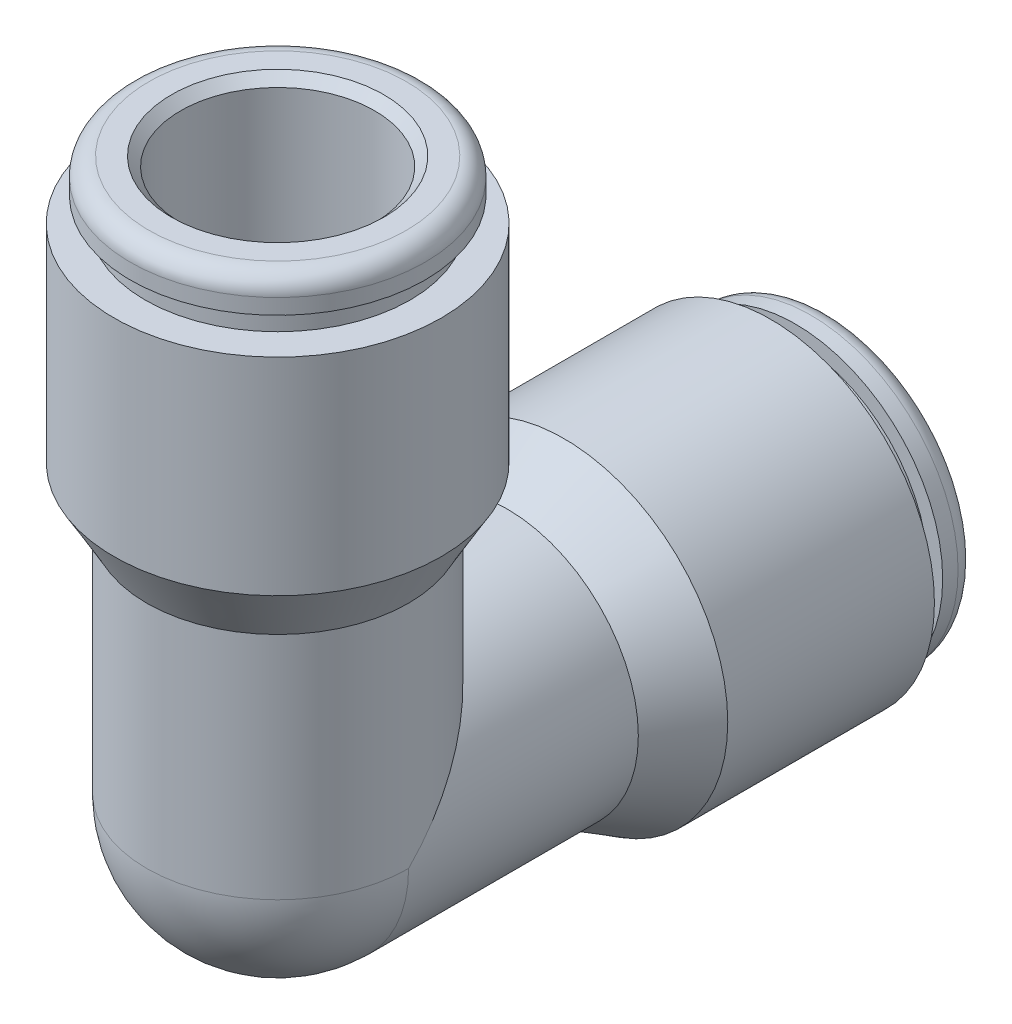
ISO-10303-21;
HEADER;
FILE_DESCRIPTION(('STEP AP214'),'2;1');
FILE_NAME('part.step','',(''),(''),'','','');
FILE_SCHEMA(('AUTOMOTIVE_DESIGN { 1 0 10303 214 1 1 1 1 }'));
ENDSEC;
DATA;
#1=APPLICATION_CONTEXT('core data for automotive mechanical design processes');
#2=APPLICATION_PROTOCOL_DEFINITION('international standard','automotive_design',2000,#1);
#3=PRODUCT_CONTEXT('',#1,'mechanical');
#4=PRODUCT('Part','Part','',(#3));
#5=PRODUCT_RELATED_PRODUCT_CATEGORY('part','',(#4));
#6=PRODUCT_DEFINITION_FORMATION('','',#4);
#7=PRODUCT_DEFINITION_CONTEXT('part definition',#1,'design');
#8=PRODUCT_DEFINITION('design','',#6,#7);
#9=PRODUCT_DEFINITION_SHAPE('','',#8);
#10=(LENGTH_UNIT() NAMED_UNIT(*) SI_UNIT(.MILLI.,.METRE.));
#11=(NAMED_UNIT(*) PLANE_ANGLE_UNIT() SI_UNIT($,.RADIAN.));
#12=(NAMED_UNIT(*) SI_UNIT($,.STERADIAN.) SOLID_ANGLE_UNIT());
#13=UNCERTAINTY_MEASURE_WITH_UNIT(LENGTH_MEASURE(1.E-05),#10,'distance_accuracy_value','');
#14=(GEOMETRIC_REPRESENTATION_CONTEXT(3) GLOBAL_UNCERTAINTY_ASSIGNED_CONTEXT((#13)) GLOBAL_UNIT_ASSIGNED_CONTEXT((#10,
#11,#12)) REPRESENTATION_CONTEXT('',''));
#15=CARTESIAN_POINT('',(0.,0.,0.));
#16=DIRECTION('',(0.,0.,1.));
#17=DIRECTION('',(1.,0.,0.));
#18=AXIS2_PLACEMENT_3D('',#15,#16,#17);
#19=CARTESIAN_POINT('',(0.,0.,0.));
#20=DIRECTION('',(0.,0.,1.));
#21=DIRECTION('',(1.,0.,0.));
#22=AXIS2_PLACEMENT_3D('',#19,#20,#21);
#23=CYLINDRICAL_SURFACE('',#22,3.238);
#24=CARTESIAN_POINT('',(0.,0.,-8.));
#25=DIRECTION('',(0.,0.,1.));
#26=DIRECTION('',(1.,0.,0.));
#27=AXIS2_PLACEMENT_3D('',#24,#25,#26);
#28=CIRCLE('',#27,3.238);
#29=CARTESIAN_POINT('',(3.238,0.,-8.));
#30=VERTEX_POINT('',#29);
#31=EDGE_CURVE('E11',#30,#30,#28,.T.);
#32=ORIENTED_EDGE('',*,*,#31,.F.);
#33=EDGE_LOOP('',(#32));
#34=FACE_BOUND('',#33,.T.);
#35=CARTESIAN_POINT('',(0.,0.,0.));
#36=DIRECTION('',(0.,0.707106781186546,0.707106781186549));
#37=DIRECTION('',(0.,-0.707106781186549,0.707106781186546));
#38=AXIS2_PLACEMENT_3D('',#35,#36,#37);
#39=ELLIPSE('',#38,4.57922351496407,3.238);
#40=CARTESIAN_POINT('',(-3.238,0.,0.));
#41=VERTEX_POINT('',#40);
#42=CARTESIAN_POINT('',(3.238,0.,0.));
#43=VERTEX_POINT('',#42);
#44=EDGE_CURVE('E66',#41,#43,#39,.F.);
#45=ORIENTED_EDGE('',*,*,#44,.F.);
#46=CARTESIAN_POINT('',(0.,0.,0.));
#47=DIRECTION('',(0.,0.,-1.));
#48=DIRECTION('',(1.,0.,0.));
#49=AXIS2_PLACEMENT_3D('',#46,#47,#48);
#50=CIRCLE('',#49,3.238);
#51=EDGE_CURVE('E76',#43,#41,#50,.T.);
#52=ORIENTED_EDGE('',*,*,#51,.F.);
#53=EDGE_LOOP('',(#45,#52));
#54=FACE_BOUND('',#53,.T.);
#55=ADVANCED_FACE('F39',(#34,#54),#23,.F.);
#56=CARTESIAN_POINT('',(0.,0.,0.));
#57=DIRECTION('',(0.,0.,1.));
#58=DIRECTION('',(1.,0.,0.));
#59=AXIS2_PLACEMENT_3D('',#56,#57,#58);
#60=CYLINDRICAL_SURFACE('',#59,5.4);
#61=CARTESIAN_POINT('',(0.,0.,-9.475));
#62=DIRECTION('',(0.,0.,1.));
#63=DIRECTION('',(1.,0.,0.));
#64=AXIS2_PLACEMENT_3D('',#61,#62,#63);
#65=CIRCLE('',#64,5.4);
#66=CARTESIAN_POINT('',(5.4,0.,-9.475));
#67=VERTEX_POINT('',#66);
#68=EDGE_CURVE('E48',#67,#67,#65,.T.);
#69=ORIENTED_EDGE('',*,*,#68,.T.);
#70=EDGE_LOOP('',(#69));
#71=FACE_BOUND('',#70,.T.);
#72=CARTESIAN_POINT('',(0.,0.,0.));
#73=DIRECTION('',(0.,0.707106781186546,0.707106781186549));
#74=DIRECTION('',(0.,-0.707106781186549,0.707106781186546));
#75=AXIS2_PLACEMENT_3D('',#72,#73,#74);
#76=ELLIPSE('',#75,7.6367532368147,5.4);
#77=CARTESIAN_POINT('',(5.4,0.,0.));
#78=VERTEX_POINT('',#77);
#79=CARTESIAN_POINT('',(-5.4,0.,0.));
#80=VERTEX_POINT('',#79);
#81=EDGE_CURVE('E85',#78,#80,#76,.T.);
#82=ORIENTED_EDGE('',*,*,#81,.F.);
#83=CARTESIAN_POINT('',(0.,0.,0.));
#84=DIRECTION('',(0.,0.,1.));
#85=DIRECTION('',(1.,0.,0.));
#86=AXIS2_PLACEMENT_3D('',#83,#84,#85);
#87=CIRCLE('',#86,5.4);
#88=EDGE_CURVE('E55',#80,#78,#87,.T.);
#89=ORIENTED_EDGE('',*,*,#88,.F.);
#90=EDGE_LOOP('',(#82,#89));
#91=FACE_BOUND('',#90,.T.);
#92=ADVANCED_FACE('F184',(#71,#91),#60,.T.);
#93=CARTESIAN_POINT('',(0.,4.,-8.));
#94=DIRECTION('',(0.,0.,1.));
#95=DIRECTION('',(1.,0.,0.));
#96=AXIS2_PLACEMENT_3D('',#93,#94,#95);
#97=PLANE('',#96);
#98=CARTESIAN_POINT('',(0.,0.,-8.));
#99=DIRECTION('',(0.,0.,1.));
#100=DIRECTION('',(1.,0.,0.));
#101=AXIS2_PLACEMENT_3D('',#98,#99,#100);
#102=CIRCLE('',#101,4.);
#103=CARTESIAN_POINT('',(4.,0.,-8.));
#104=VERTEX_POINT('',#103);
#105=EDGE_CURVE('E78',#104,#104,#102,.T.);
#106=ORIENTED_EDGE('',*,*,#105,.F.);
#107=EDGE_LOOP('',(#106));
#108=FACE_BOUND('',#107,.T.);
#109=ORIENTED_EDGE('',*,*,#31,.T.);
#110=EDGE_LOOP('',(#109));
#111=FACE_BOUND('',#110,.T.);
#112=ADVANCED_FACE('F41',(#108,#111),#97,.F.);
#113=CARTESIAN_POINT('',(0.,0.,-11.813268590218));
#114=DIRECTION('',(0.,0.,-1.));
#115=DIRECTION('',(-1.,0.,0.));
#116=AXIS2_PLACEMENT_3D('',#113,#114,#115);
#117=CONICAL_SURFACE('',#116,6.75,0.523598775598301);
#118=ORIENTED_EDGE('',*,*,#68,.F.);
#119=EDGE_LOOP('',(#118));
#120=FACE_BOUND('',#119,.T.);
#121=CARTESIAN_POINT('',(0.,0.,-11.813268590218));
#122=DIRECTION('',(0.,0.,1.));
#123=DIRECTION('',(1.,0.,0.));
#124=AXIS2_PLACEMENT_3D('',#121,#122,#123);
#125=CIRCLE('',#124,6.75);
#126=CARTESIAN_POINT('',(6.75,0.,-11.813268590218));
#127=VERTEX_POINT('',#126);
#128=EDGE_CURVE('E121',#127,#127,#125,.T.);
#129=ORIENTED_EDGE('',*,*,#128,.T.);
#130=EDGE_LOOP('',(#129));
#131=FACE_BOUND('',#130,.T.);
#132=ADVANCED_FACE('F193',(#120,#131),#117,.T.);
#133=CARTESIAN_POINT('',(0.,0.,0.));
#134=DIRECTION('',(0.,0.,1.));
#135=DIRECTION('',(1.,0.,0.));
#136=AXIS2_PLACEMENT_3D('',#133,#134,#135);
#137=CYLINDRICAL_SURFACE('',#136,6.75);
#138=ORIENTED_EDGE('',*,*,#128,.F.);
#139=EDGE_LOOP('',(#138));
#140=FACE_BOUND('',#139,.T.);
#141=CARTESIAN_POINT('',(0.,0.,-20.337));
#142=DIRECTION('',(0.,0.,1.));
#143=DIRECTION('',(1.,0.,0.));
#144=AXIS2_PLACEMENT_3D('',#141,#142,#143);
#145=CIRCLE('',#144,6.75);
#146=CARTESIAN_POINT('',(6.75,0.,-20.337));
#147=VERTEX_POINT('',#146);
#148=EDGE_CURVE('E118',#147,#147,#145,.T.);
#149=ORIENTED_EDGE('',*,*,#148,.T.);
#150=EDGE_LOOP('',(#149));
#151=FACE_BOUND('',#150,.T.);
#152=ADVANCED_FACE('F196',(#140,#151),#137,.T.);
#153=CARTESIAN_POINT('',(0.,6.75,-20.337));
#154=DIRECTION('',(0.,0.,1.));
#155=DIRECTION('',(1.,0.,0.));
#156=AXIS2_PLACEMENT_3D('',#153,#154,#155);
#157=PLANE('',#156);
#158=ORIENTED_EDGE('',*,*,#148,.F.);
#159=EDGE_LOOP('',(#158));
#160=FACE_BOUND('',#159,.T.);
#161=CARTESIAN_POINT('',(0.,0.,-20.337));
#162=DIRECTION('',(0.,0.,1.));
#163=DIRECTION('',(1.,0.,0.));
#164=AXIS2_PLACEMENT_3D('',#161,#162,#163);
#165=CIRCLE('',#164,5.4675);
#166=CARTESIAN_POINT('',(5.4675,0.,-20.337));
#167=VERTEX_POINT('',#166);
#168=EDGE_CURVE('E115',#167,#167,#165,.T.);
#169=ORIENTED_EDGE('',*,*,#168,.T.);
#170=EDGE_LOOP('',(#169));
#171=FACE_BOUND('',#170,.T.);
#172=ADVANCED_FACE('F200',(#160,#171),#157,.F.);
#173=CARTESIAN_POINT('',(0.,0.,0.));
#174=DIRECTION('',(0.,0.,1.));
#175=DIRECTION('',(1.,0.,0.));
#176=AXIS2_PLACEMENT_3D('',#173,#174,#175);
#177=CYLINDRICAL_SURFACE('',#176,5.4675);
#178=ORIENTED_EDGE('',*,*,#168,.F.);
#179=EDGE_LOOP('',(#178));
#180=FACE_BOUND('',#179,.T.);
#181=CARTESIAN_POINT('',(0.,0.,-21.353));
#182=DIRECTION('',(0.,0.,1.));
#183=DIRECTION('',(1.,0.,0.));
#184=AXIS2_PLACEMENT_3D('',#181,#182,#183);
#185=CIRCLE('',#184,5.4675);
#186=CARTESIAN_POINT('',(5.4675,0.,-21.353));
#187=VERTEX_POINT('',#186);
#188=EDGE_CURVE('E112',#187,#187,#185,.T.);
#189=ORIENTED_EDGE('',*,*,#188,.T.);
#190=EDGE_LOOP('',(#189));
#191=FACE_BOUND('',#190,.T.);
#192=ADVANCED_FACE('F204',(#180,#191),#177,.T.);
#193=CARTESIAN_POINT('',(0.,6.075,-21.353));
#194=DIRECTION('',(0.,0.,-1.));
#195=DIRECTION('',(-1.,0.,0.));
#196=AXIS2_PLACEMENT_3D('',#193,#194,#195);
#197=PLANE('',#196);
#198=ORIENTED_EDGE('',*,*,#188,.F.);
#199=EDGE_LOOP('',(#198));
#200=FACE_BOUND('',#199,.T.);
#201=CARTESIAN_POINT('',(0.,0.,-21.353));
#202=DIRECTION('',(0.,0.,1.));
#203=DIRECTION('',(1.,0.,0.));
#204=AXIS2_PLACEMENT_3D('',#201,#202,#203);
#205=CIRCLE('',#204,6.075);
#206=CARTESIAN_POINT('',(6.075,0.,-21.353));
#207=VERTEX_POINT('',#206);
#208=EDGE_CURVE('E109',#207,#207,#205,.T.);
#209=ORIENTED_EDGE('',*,*,#208,.T.);
#210=EDGE_LOOP('',(#209));
#211=FACE_BOUND('',#210,.T.);
#212=ADVANCED_FACE('F208',(#200,#211),#197,.F.);
#213=CARTESIAN_POINT('',(0.,0.,0.));
#214=DIRECTION('',(0.,0.,1.));
#215=DIRECTION('',(1.,0.,0.));
#216=AXIS2_PLACEMENT_3D('',#213,#214,#215);
#217=CYLINDRICAL_SURFACE('',#216,6.075);
#218=ORIENTED_EDGE('',*,*,#208,.F.);
#219=EDGE_LOOP('',(#218));
#220=FACE_BOUND('',#219,.T.);
#221=CARTESIAN_POINT('',(0.,0.,-21.988));
#222=DIRECTION('',(0.,0.,1.));
#223=DIRECTION('',(1.,0.,0.));
#224=AXIS2_PLACEMENT_3D('',#221,#222,#223);
#225=CIRCLE('',#224,6.075);
#226=CARTESIAN_POINT('',(6.075,0.,-21.988));
#227=VERTEX_POINT('',#226);
#228=EDGE_CURVE('E106',#227,#227,#225,.T.);
#229=ORIENTED_EDGE('',*,*,#228,.T.);
#230=EDGE_LOOP('',(#229));
#231=FACE_BOUND('',#230,.T.);
#232=ADVANCED_FACE('F212',(#220,#231),#217,.T.);
#233=CARTESIAN_POINT('',(0.,0.,-21.988));
#234=DIRECTION('',(0.,0.,1.));
#235=DIRECTION('',(1.,0.,0.));
#236=AXIS2_PLACEMENT_3D('',#233,#234,#235);
#237=TOROIDAL_SURFACE('',#236,5.313,0.761999999999999);
#238=ORIENTED_EDGE('',*,*,#228,.F.);
#239=EDGE_LOOP('',(#238));
#240=FACE_BOUND('',#239,.T.);
#241=CARTESIAN_POINT('',(0.,0.,-22.75));
#242=DIRECTION('',(0.,0.,1.));
#243=DIRECTION('',(1.,0.,0.));
#244=AXIS2_PLACEMENT_3D('',#241,#242,#243);
#245=CIRCLE('',#244,5.313);
#246=CARTESIAN_POINT('',(5.313,0.,-22.75));
#247=VERTEX_POINT('',#246);
#248=EDGE_CURVE('E103',#247,#247,#245,.T.);
#249=ORIENTED_EDGE('',*,*,#248,.T.);
#250=EDGE_LOOP('',(#249));
#251=FACE_BOUND('',#250,.T.);
#252=ADVANCED_FACE('F216',(#240,#251),#237,.T.);
#253=CARTESIAN_POINT('',(0.,5.313,-22.75));
#254=DIRECTION('',(0.,0.,1.));
#255=DIRECTION('',(1.,0.,0.));
#256=AXIS2_PLACEMENT_3D('',#253,#254,#255);
#257=PLANE('',#256);
#258=ORIENTED_EDGE('',*,*,#248,.F.);
#259=EDGE_LOOP('',(#258));
#260=FACE_BOUND('',#259,.T.);
#261=CARTESIAN_POINT('',(0.,0.,-22.75));
#262=DIRECTION('',(0.,0.,1.));
#263=DIRECTION('',(1.,0.,0.));
#264=AXIS2_PLACEMENT_3D('',#261,#262,#263);
#265=CIRCLE('',#264,4.381);
#266=CARTESIAN_POINT('',(4.381,0.,-22.75));
#267=VERTEX_POINT('',#266);
#268=EDGE_CURVE('E100',#267,#267,#265,.T.);
#269=ORIENTED_EDGE('',*,*,#268,.T.);
#270=EDGE_LOOP('',(#269));
#271=FACE_BOUND('',#270,.T.);
#272=ADVANCED_FACE('F220',(#260,#271),#257,.F.);
#273=CARTESIAN_POINT('',(0.,0.,-22.369));
#274=DIRECTION('',(0.,0.,-1.));
#275=DIRECTION('',(-1.,0.,0.));
#276=AXIS2_PLACEMENT_3D('',#273,#274,#275);
#277=CONICAL_SURFACE('',#276,4.,0.78539816339745);
#278=ORIENTED_EDGE('',*,*,#268,.F.);
#279=EDGE_LOOP('',(#278));
#280=FACE_BOUND('',#279,.T.);
#281=CARTESIAN_POINT('',(0.,0.,-22.369));
#282=DIRECTION('',(0.,0.,1.));
#283=DIRECTION('',(1.,0.,0.));
#284=AXIS2_PLACEMENT_3D('',#281,#282,#283);
#285=CIRCLE('',#284,4.);
#286=CARTESIAN_POINT('',(4.,0.,-22.369));
#287=VERTEX_POINT('',#286);
#288=EDGE_CURVE('E97',#287,#287,#285,.T.);
#289=ORIENTED_EDGE('',*,*,#288,.T.);
#290=EDGE_LOOP('',(#289));
#291=FACE_BOUND('',#290,.T.);
#292=ADVANCED_FACE('F224',(#280,#291),#277,.F.);
#293=CARTESIAN_POINT('',(0.,0.,0.));
#294=DIRECTION('',(0.,0.,1.));
#295=DIRECTION('',(1.,0.,0.));
#296=AXIS2_PLACEMENT_3D('',#293,#294,#295);
#297=CYLINDRICAL_SURFACE('',#296,4.);
#298=ORIENTED_EDGE('',*,*,#288,.F.);
#299=EDGE_LOOP('',(#298));
#300=FACE_BOUND('',#299,.T.);
#301=ORIENTED_EDGE('',*,*,#105,.T.);
#302=EDGE_LOOP('',(#301));
#303=FACE_BOUND('',#302,.T.);
#304=ADVANCED_FACE('F228',(#300,#303),#297,.F.);
#305=CARTESIAN_POINT('',(0.,0.,0.));
#306=DIRECTION('',(1.,0.,0.));
#307=DIRECTION('',(0.,0.,1.));
#308=AXIS2_PLACEMENT_3D('',#305,#306,#307);
#309=SPHERICAL_SURFACE('',#308,5.4);
#310=ORIENTED_EDGE('',*,*,#88,.T.);
#311=CARTESIAN_POINT('',(0.,0.,0.));
#312=DIRECTION('',(0.,-1.,0.));
#313=DIRECTION('',(1.,0.,0.));
#314=AXIS2_PLACEMENT_3D('',#311,#312,#313);
#315=CIRCLE('',#314,5.4);
#316=EDGE_CURVE('E82',#78,#80,#315,.T.);
#317=ORIENTED_EDGE('',*,*,#316,.T.);
#318=EDGE_LOOP('',(#310,#317));
#319=FACE_BOUND('',#318,.T.);
#320=ADVANCED_FACE('F232',(#319),#309,.T.);
#321=CARTESIAN_POINT('',(0.,0.,0.));
#322=DIRECTION('',(1.,0.,0.));
#323=DIRECTION('',(0.,0.,-1.));
#324=AXIS2_PLACEMENT_3D('',#321,#322,#323);
#325=SPHERICAL_SURFACE('',#324,3.238);
#326=ORIENTED_EDGE('',*,*,#51,.T.);
#327=CARTESIAN_POINT('',(0.,0.,0.));
#328=DIRECTION('',(0.,-1.,0.));
#329=DIRECTION('',(1.,0.,0.));
#330=AXIS2_PLACEMENT_3D('',#327,#328,#329);
#331=CIRCLE('',#330,3.238);
#332=EDGE_CURVE('E71',#43,#41,#331,.T.);
#333=ORIENTED_EDGE('',*,*,#332,.F.);
#334=EDGE_LOOP('',(#326,#333));
#335=FACE_BOUND('',#334,.T.);
#336=ADVANCED_FACE('F80',(#335),#325,.F.);
#337=CARTESIAN_POINT('',(0.,0.,0.));
#338=DIRECTION('',(0.,-1.,0.));
#339=DIRECTION('',(1.,0.,0.));
#340=AXIS2_PLACEMENT_3D('',#337,#338,#339);
#341=CYLINDRICAL_SURFACE('',#340,4.);
#342=CARTESIAN_POINT('',(0.,22.369,0.));
#343=DIRECTION('',(0.,-1.,0.));
#344=DIRECTION('',(1.,0.,0.));
#345=AXIS2_PLACEMENT_3D('',#342,#343,#344);
#346=CIRCLE('',#345,4.);
#347=CARTESIAN_POINT('',(4.,22.369,0.));
#348=VERTEX_POINT('',#347);
#349=EDGE_CURVE('E159',#348,#348,#346,.T.);
#350=ORIENTED_EDGE('',*,*,#349,.F.);
#351=EDGE_LOOP('',(#350));
#352=FACE_BOUND('',#351,.T.);
#353=CARTESIAN_POINT('',(0.,8.,0.));
#354=DIRECTION('',(0.,-1.,0.));
#355=DIRECTION('',(1.,0.,0.));
#356=AXIS2_PLACEMENT_3D('',#353,#354,#355);
#357=CIRCLE('',#356,4.);
#358=CARTESIAN_POINT('',(4.,8.,0.));
#359=VERTEX_POINT('',#358);
#360=EDGE_CURVE('E74',#359,#359,#357,.T.);
#361=ORIENTED_EDGE('',*,*,#360,.T.);
#362=EDGE_LOOP('',(#361));
#363=FACE_BOUND('',#362,.T.);
#364=ADVANCED_FACE('F167',(#352,#363),#341,.F.);
#365=CARTESIAN_POINT('',(0.,22.369,0.));
#366=DIRECTION('',(0.,1.,0.));
#367=DIRECTION('',(-1.,0.,0.));
#368=AXIS2_PLACEMENT_3D('',#365,#366,#367);
#369=CONICAL_SURFACE('',#368,4.,0.78539816339745);
#370=CARTESIAN_POINT('',(0.,22.75,0.));
#371=DIRECTION('',(0.,-1.,0.));
#372=DIRECTION('',(1.,0.,0.));
#373=AXIS2_PLACEMENT_3D('',#370,#371,#372);
#374=CIRCLE('',#373,4.381);
#375=CARTESIAN_POINT('',(4.381,22.75,0.));
#376=VERTEX_POINT('',#375);
#377=EDGE_CURVE('E156',#376,#376,#374,.T.);
#378=ORIENTED_EDGE('',*,*,#377,.F.);
#379=EDGE_LOOP('',(#378));
#380=FACE_BOUND('',#379,.T.);
#381=ORIENTED_EDGE('',*,*,#349,.T.);
#382=EDGE_LOOP('',(#381));
#383=FACE_BOUND('',#382,.T.);
#384=ADVANCED_FACE('F252',(#380,#383),#369,.F.);
#385=CARTESIAN_POINT('',(0.,22.75,5.31300000000008));
#386=DIRECTION('',(0.,-1.,0.));
#387=DIRECTION('',(1.,0.,0.));
#388=AXIS2_PLACEMENT_3D('',#385,#386,#387);
#389=PLANE('',#388);
#390=CARTESIAN_POINT('',(0.,22.75,0.));
#391=DIRECTION('',(0.,-1.,0.));
#392=DIRECTION('',(1.,0.,0.));
#393=AXIS2_PLACEMENT_3D('',#390,#391,#392);
#394=CIRCLE('',#393,5.313);
#395=CARTESIAN_POINT('',(5.313,22.75,0.));
#396=VERTEX_POINT('',#395);
#397=EDGE_CURVE('E153',#396,#396,#394,.T.);
#398=ORIENTED_EDGE('',*,*,#397,.F.);
#399=EDGE_LOOP('',(#398));
#400=FACE_BOUND('',#399,.T.);
#401=ORIENTED_EDGE('',*,*,#377,.T.);
#402=EDGE_LOOP('',(#401));
#403=FACE_BOUND('',#402,.T.);
#404=ADVANCED_FACE('F261',(#400,#403),#389,.F.);
#405=CARTESIAN_POINT('',(0.,21.988,0.));
#406=DIRECTION('',(0.,-1.,0.));
#407=DIRECTION('',(1.,0.,0.));
#408=AXIS2_PLACEMENT_3D('',#405,#406,#407);
#409=TOROIDAL_SURFACE('',#408,5.313,0.761999999999999);
#410=CARTESIAN_POINT('',(0.,21.988,0.));
#411=DIRECTION('',(0.,-1.,0.));
#412=DIRECTION('',(1.,0.,0.));
#413=AXIS2_PLACEMENT_3D('',#410,#411,#412);
#414=CIRCLE('',#413,6.075);
#415=CARTESIAN_POINT('',(6.075,21.988,0.));
#416=VERTEX_POINT('',#415);
#417=EDGE_CURVE('E150',#416,#416,#414,.T.);
#418=ORIENTED_EDGE('',*,*,#417,.F.);
#419=EDGE_LOOP('',(#418));
#420=FACE_BOUND('',#419,.T.);
#421=ORIENTED_EDGE('',*,*,#397,.T.);
#422=EDGE_LOOP('',(#421));
#423=FACE_BOUND('',#422,.T.);
#424=ADVANCED_FACE('F271',(#420,#423),#409,.T.);
#425=CARTESIAN_POINT('',(0.,0.,0.));
#426=DIRECTION('',(0.,-1.,0.));
#427=DIRECTION('',(1.,0.,0.));
#428=AXIS2_PLACEMENT_3D('',#425,#426,#427);
#429=CYLINDRICAL_SURFACE('',#428,6.075);
#430=CARTESIAN_POINT('',(0.,21.353,0.));
#431=DIRECTION('',(0.,-1.,0.));
#432=DIRECTION('',(1.,0.,0.));
#433=AXIS2_PLACEMENT_3D('',#430,#431,#432);
#434=CIRCLE('',#433,6.075);
#435=CARTESIAN_POINT('',(6.075,21.353,0.));
#436=VERTEX_POINT('',#435);
#437=EDGE_CURVE('E147',#436,#436,#434,.T.);
#438=ORIENTED_EDGE('',*,*,#437,.F.);
#439=EDGE_LOOP('',(#438));
#440=FACE_BOUND('',#439,.T.);
#441=ORIENTED_EDGE('',*,*,#417,.T.);
#442=EDGE_LOOP('',(#441));
#443=FACE_BOUND('',#442,.T.);
#444=ADVANCED_FACE('F279',(#440,#443),#429,.T.);
#445=CARTESIAN_POINT('',(0.,21.353,6.07500000000007));
#446=DIRECTION('',(0.,1.,0.));
#447=DIRECTION('',(-1.,0.,0.));
#448=AXIS2_PLACEMENT_3D('',#445,#446,#447);
#449=PLANE('',#448);
#450=CARTESIAN_POINT('',(0.,21.353,0.));
#451=DIRECTION('',(0.,-1.,0.));
#452=DIRECTION('',(1.,0.,0.));
#453=AXIS2_PLACEMENT_3D('',#450,#451,#452);
#454=CIRCLE('',#453,5.4675);
#455=CARTESIAN_POINT('',(5.4675,21.353,0.));
#456=VERTEX_POINT('',#455);
#457=EDGE_CURVE('E144',#456,#456,#454,.T.);
#458=ORIENTED_EDGE('',*,*,#457,.F.);
#459=EDGE_LOOP('',(#458));
#460=FACE_BOUND('',#459,.T.);
#461=ORIENTED_EDGE('',*,*,#437,.T.);
#462=EDGE_LOOP('',(#461));
#463=FACE_BOUND('',#462,.T.);
#464=ADVANCED_FACE('F286',(#460,#463),#449,.F.);
#465=CARTESIAN_POINT('',(0.,0.,0.));
#466=DIRECTION('',(0.,-1.,0.));
#467=DIRECTION('',(1.,0.,0.));
#468=AXIS2_PLACEMENT_3D('',#465,#466,#467);
#469=CYLINDRICAL_SURFACE('',#468,5.4675);
#470=CARTESIAN_POINT('',(0.,20.337,0.));
#471=DIRECTION('',(0.,-1.,0.));
#472=DIRECTION('',(1.,0.,0.));
#473=AXIS2_PLACEMENT_3D('',#470,#471,#472);
#474=CIRCLE('',#473,5.4675);
#475=CARTESIAN_POINT('',(5.4675,20.337,0.));
#476=VERTEX_POINT('',#475);
#477=EDGE_CURVE('E141',#476,#476,#474,.T.);
#478=ORIENTED_EDGE('',*,*,#477,.F.);
#479=EDGE_LOOP('',(#478));
#480=FACE_BOUND('',#479,.T.);
#481=ORIENTED_EDGE('',*,*,#457,.T.);
#482=EDGE_LOOP('',(#481));
#483=FACE_BOUND('',#482,.T.);
#484=ADVANCED_FACE('F294',(#480,#483),#469,.T.);
#485=CARTESIAN_POINT('',(0.,20.337,6.75000000000007));
#486=DIRECTION('',(0.,-1.,0.));
#487=DIRECTION('',(1.,0.,0.));
#488=AXIS2_PLACEMENT_3D('',#485,#486,#487);
#489=PLANE('',#488);
#490=CARTESIAN_POINT('',(0.,20.337,0.));
#491=DIRECTION('',(0.,-1.,0.));
#492=DIRECTION('',(1.,0.,0.));
#493=AXIS2_PLACEMENT_3D('',#490,#491,#492);
#494=CIRCLE('',#493,6.75);
#495=CARTESIAN_POINT('',(6.75,20.337,0.));
#496=VERTEX_POINT('',#495);
#497=EDGE_CURVE('E138',#496,#496,#494,.T.);
#498=ORIENTED_EDGE('',*,*,#497,.F.);
#499=EDGE_LOOP('',(#498));
#500=FACE_BOUND('',#499,.T.);
#501=ORIENTED_EDGE('',*,*,#477,.T.);
#502=EDGE_LOOP('',(#501));
#503=FACE_BOUND('',#502,.T.);
#504=ADVANCED_FACE('F302',(#500,#503),#489,.F.);
#505=CARTESIAN_POINT('',(0.,0.,0.));
#506=DIRECTION('',(0.,-1.,0.));
#507=DIRECTION('',(1.,0.,0.));
#508=AXIS2_PLACEMENT_3D('',#505,#506,#507);
#509=CYLINDRICAL_SURFACE('',#508,6.75);
#510=CARTESIAN_POINT('',(0.,11.813268590218,0.));
#511=DIRECTION('',(0.,-1.,0.));
#512=DIRECTION('',(1.,0.,0.));
#513=AXIS2_PLACEMENT_3D('',#510,#511,#512);
#514=CIRCLE('',#513,6.75);
#515=CARTESIAN_POINT('',(6.75,11.813268590218,0.));
#516=VERTEX_POINT('',#515);
#517=EDGE_CURVE('E135',#516,#516,#514,.T.);
#518=ORIENTED_EDGE('',*,*,#517,.F.);
#519=EDGE_LOOP('',(#518));
#520=FACE_BOUND('',#519,.T.);
#521=ORIENTED_EDGE('',*,*,#497,.T.);
#522=EDGE_LOOP('',(#521));
#523=FACE_BOUND('',#522,.T.);
#524=ADVANCED_FACE('F310',(#520,#523),#509,.T.);
#525=CARTESIAN_POINT('',(0.,11.813268590218,0.));
#526=DIRECTION('',(0.,1.,0.));
#527=DIRECTION('',(-1.,0.,0.));
#528=AXIS2_PLACEMENT_3D('',#525,#526,#527);
#529=CONICAL_SURFACE('',#528,6.75,0.523598775598301);
#530=CARTESIAN_POINT('',(0.,9.475,0.));
#531=DIRECTION('',(0.,-1.,0.));
#532=DIRECTION('',(1.,0.,0.));
#533=AXIS2_PLACEMENT_3D('',#530,#531,#532);
#534=CIRCLE('',#533,5.4);
#535=CARTESIAN_POINT('',(5.4,9.475,0.));
#536=VERTEX_POINT('',#535);
#537=EDGE_CURVE('E87',#536,#536,#534,.T.);
#538=ORIENTED_EDGE('',*,*,#537,.F.);
#539=EDGE_LOOP('',(#538));
#540=FACE_BOUND('',#539,.T.);
#541=ORIENTED_EDGE('',*,*,#517,.T.);
#542=EDGE_LOOP('',(#541));
#543=FACE_BOUND('',#542,.T.);
#544=ADVANCED_FACE('F173',(#540,#543),#529,.T.);
#545=CARTESIAN_POINT('',(0.,7.99999999999998,4.00000000000003));
#546=DIRECTION('',(0.,-1.,0.));
#547=DIRECTION('',(1.,0.,0.));
#548=AXIS2_PLACEMENT_3D('',#545,#546,#547);
#549=PLANE('',#548);
#550=ORIENTED_EDGE('',*,*,#360,.F.);
#551=EDGE_LOOP('',(#550));
#552=FACE_BOUND('',#551,.T.);
#553=CARTESIAN_POINT('',(0.,8.,0.));
#554=DIRECTION('',(0.,-1.,0.));
#555=DIRECTION('',(1.,0.,0.));
#556=AXIS2_PLACEMENT_3D('',#553,#554,#555);
#557=CIRCLE('',#556,3.238);
#558=CARTESIAN_POINT('',(3.238,8.,0.));
#559=VERTEX_POINT('',#558);
#560=EDGE_CURVE('E81',#559,#559,#557,.T.);
#561=ORIENTED_EDGE('',*,*,#560,.T.);
#562=EDGE_LOOP('',(#561));
#563=FACE_BOUND('',#562,.T.);
#564=ADVANCED_FACE('F169',(#552,#563),#549,.F.);
#565=CARTESIAN_POINT('',(0.,0.,0.));
#566=DIRECTION('',(0.,-1.,0.));
#567=DIRECTION('',(1.,0.,0.));
#568=AXIS2_PLACEMENT_3D('',#565,#566,#567);
#569=CYLINDRICAL_SURFACE('',#568,5.4);
#570=ORIENTED_EDGE('',*,*,#537,.T.);
#571=EDGE_LOOP('',(#570));
#572=FACE_BOUND('',#571,.T.);
#573=ORIENTED_EDGE('',*,*,#316,.F.);
#574=ORIENTED_EDGE('',*,*,#81,.T.);
#575=EDGE_LOOP('',(#573,#574));
#576=FACE_BOUND('',#575,.T.);
#577=ADVANCED_FACE('F172',(#572,#576),#569,.T.);
#578=CARTESIAN_POINT('',(0.,0.,0.));
#579=DIRECTION('',(0.,-1.,0.));
#580=DIRECTION('',(1.,0.,0.));
#581=AXIS2_PLACEMENT_3D('',#578,#579,#580);
#582=CYLINDRICAL_SURFACE('',#581,3.238);
#583=ORIENTED_EDGE('',*,*,#44,.T.);
#584=ORIENTED_EDGE('',*,*,#332,.T.);
#585=EDGE_LOOP('',(#583,#584));
#586=FACE_BOUND('',#585,.T.);
#587=ORIENTED_EDGE('',*,*,#560,.F.);
#588=EDGE_LOOP('',(#587));
#589=FACE_BOUND('',#588,.T.);
#590=ADVANCED_FACE('F68',(#586,#589),#582,.F.);
#591=CLOSED_SHELL('',(#55,#92,#112,#132,#152,#172,#192,#212,#232,#252,#272,#292,#304,#320,#336,
#364,#384,#404,#424,#444,#464,#484,#504,#524,#544,#564,#577,#590));
#592=MANIFOLD_SOLID_BREP('B2',#591);
#593=ADVANCED_BREP_SHAPE_REPRESENTATION('',(#18,#592),#14);
#594=SHAPE_DEFINITION_REPRESENTATION(#9,#593);
ENDSEC;
END-ISO-10303-21;
